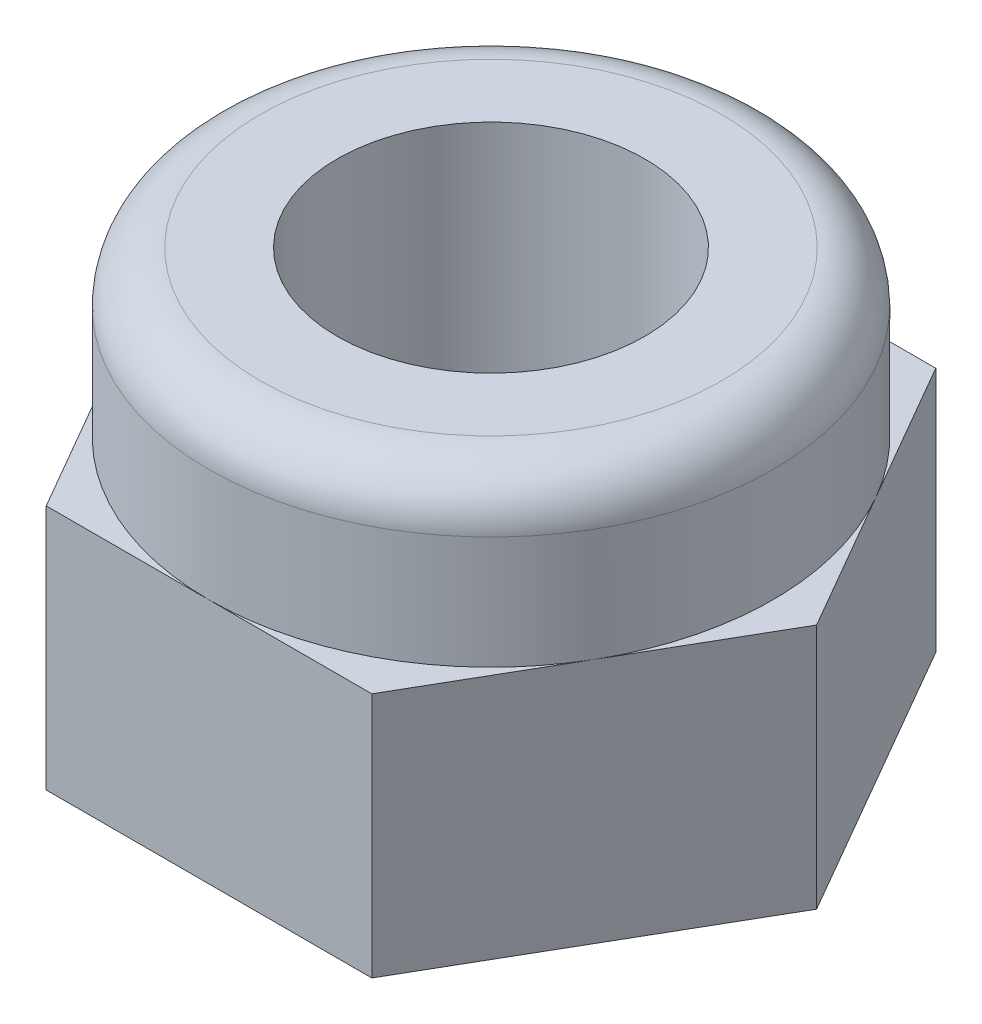
ISO-10303-21;
HEADER;
FILE_DESCRIPTION(('STEP AP214'),'2;1');
FILE_NAME('part.step','',(''),(''),'','','');
FILE_SCHEMA(('AUTOMOTIVE_DESIGN { 1 0 10303 214 1 1 1 1 }'));
ENDSEC;
DATA;
#1=APPLICATION_CONTEXT('core data for automotive mechanical design processes');
#2=APPLICATION_PROTOCOL_DEFINITION('international standard','automotive_design',2000,#1);
#3=PRODUCT_CONTEXT('',#1,'mechanical');
#4=PRODUCT('Part','Part','',(#3));
#5=PRODUCT_RELATED_PRODUCT_CATEGORY('part','',(#4));
#6=PRODUCT_DEFINITION_FORMATION('','',#4);
#7=PRODUCT_DEFINITION_CONTEXT('part definition',#1,'design');
#8=PRODUCT_DEFINITION('design','',#6,#7);
#9=PRODUCT_DEFINITION_SHAPE('','',#8);
#10=(LENGTH_UNIT() NAMED_UNIT(*) SI_UNIT(.MILLI.,.METRE.));
#11=(NAMED_UNIT(*) PLANE_ANGLE_UNIT() SI_UNIT($,.RADIAN.));
#12=(NAMED_UNIT(*) SI_UNIT($,.STERADIAN.) SOLID_ANGLE_UNIT());
#13=UNCERTAINTY_MEASURE_WITH_UNIT(LENGTH_MEASURE(1.E-05),#10,'distance_accuracy_value','');
#14=(GEOMETRIC_REPRESENTATION_CONTEXT(3) GLOBAL_UNCERTAINTY_ASSIGNED_CONTEXT((#13)) GLOBAL_UNIT_ASSIGNED_CONTEXT((#10,
#11,#12)) REPRESENTATION_CONTEXT('',''));
#15=CARTESIAN_POINT('',(0.,0.,0.));
#16=DIRECTION('',(0.,0.,1.));
#17=DIRECTION('',(1.,0.,0.));
#18=AXIS2_PLACEMENT_3D('',#15,#16,#17);
#19=CARTESIAN_POINT('',(0.,2.4,0.));
#20=DIRECTION('',(0.,1.,0.));
#21=DIRECTION('',(0.,0.,1.));
#22=AXIS2_PLACEMENT_3D('',#19,#20,#21);
#23=PLANE('',#22);
#24=CARTESIAN_POINT('',(0.,2.4,0.));
#25=DIRECTION('',(0.,1.,0.));
#26=DIRECTION('',(0.,0.,1.));
#27=AXIS2_PLACEMENT_3D('',#24,#25,#26);
#28=CIRCLE('',#27,2.75);
#29=CARTESIAN_POINT('',(0.,2.4,2.75));
#30=VERTEX_POINT('',#29);
#31=CARTESIAN_POINT('',(2.38156986040721,2.4,1.375));
#32=VERTEX_POINT('',#31);
#33=EDGE_CURVE('E126',#30,#32,#28,.T.);
#34=ORIENTED_EDGE('',*,*,#33,.F.);
#35=DIRECTION('',(1.,0.,0.));
#36=VECTOR('',#35,1.);
#37=CARTESIAN_POINT('',(-1.58771324027147,2.4,2.75));
#38=LINE('',#37,#36);
#39=CARTESIAN_POINT('',(1.58771324027147,2.4,2.75));
#40=VERTEX_POINT('',#39);
#41=EDGE_CURVE('E115',#30,#40,#38,.T.);
#42=ORIENTED_EDGE('',*,*,#41,.T.);
#43=DIRECTION('',(0.5,0.,-0.866025403784439));
#44=VECTOR('',#43,1.);
#45=CARTESIAN_POINT('',(1.58771324027147,2.4,2.75));
#46=LINE('',#45,#44);
#47=EDGE_CURVE('E127',#40,#32,#46,.T.);
#48=ORIENTED_EDGE('',*,*,#47,.T.);
#49=EDGE_LOOP('',(#34,#42,#48));
#50=FACE_BOUND('',#49,.T.);
#51=ADVANCED_FACE('F37',(#50),#23,.T.);
#52=CARTESIAN_POINT('',(2.38156986040721,2.4,-1.375));
#53=VERTEX_POINT('',#52);
#54=EDGE_CURVE('E133',#32,#53,#28,.T.);
#55=ORIENTED_EDGE('',*,*,#54,.F.);
#56=CARTESIAN_POINT('',(3.17542648054294,2.4,0.));
#57=VERTEX_POINT('',#56);
#58=EDGE_CURVE('E148',#32,#57,#46,.T.);
#59=ORIENTED_EDGE('',*,*,#58,.T.);
#60=DIRECTION('',(-0.5,0.,-0.866025403784438));
#61=VECTOR('',#60,1.);
#62=CARTESIAN_POINT('',(3.17542648054294,2.4,0.));
#63=LINE('',#62,#61);
#64=EDGE_CURVE('E149',#57,#53,#63,.T.);
#65=ORIENTED_EDGE('',*,*,#64,.T.);
#66=EDGE_LOOP('',(#55,#59,#65));
#67=FACE_BOUND('',#66,.T.);
#68=ADVANCED_FACE('F227',(#67),#23,.T.);
#69=CARTESIAN_POINT('',(0.,2.4,-2.75));
#70=VERTEX_POINT('',#69);
#71=EDGE_CURVE('E186',#53,#70,#28,.T.);
#72=ORIENTED_EDGE('',*,*,#71,.F.);
#73=CARTESIAN_POINT('',(1.58771324027147,2.4,-2.75));
#74=VERTEX_POINT('',#73);
#75=EDGE_CURVE('E147',#53,#74,#63,.T.);
#76=ORIENTED_EDGE('',*,*,#75,.T.);
#77=DIRECTION('',(-1.,0.,0.));
#78=VECTOR('',#77,1.);
#79=CARTESIAN_POINT('',(1.58771324027147,2.4,-2.75));
#80=LINE('',#79,#78);
#81=EDGE_CURVE('E153',#74,#70,#80,.T.);
#82=ORIENTED_EDGE('',*,*,#81,.T.);
#83=EDGE_LOOP('',(#72,#76,#82));
#84=FACE_BOUND('',#83,.T.);
#85=ADVANCED_FACE('F197',(#84),#23,.T.);
#86=CARTESIAN_POINT('',(-2.38156986040721,2.4,-1.375));
#87=VERTEX_POINT('',#86);
#88=EDGE_CURVE('E137',#70,#87,#28,.T.);
#89=ORIENTED_EDGE('',*,*,#88,.F.);
#90=CARTESIAN_POINT('',(-1.58771324027147,2.4,-2.75));
#91=VERTEX_POINT('',#90);
#92=EDGE_CURVE('E152',#70,#91,#80,.T.);
#93=ORIENTED_EDGE('',*,*,#92,.T.);
#94=DIRECTION('',(-0.5,0.,0.866025403784438));
#95=VECTOR('',#94,1.);
#96=CARTESIAN_POINT('',(-1.58771324027147,2.4,-2.75));
#97=LINE('',#96,#95);
#98=EDGE_CURVE('E157',#91,#87,#97,.T.);
#99=ORIENTED_EDGE('',*,*,#98,.T.);
#100=EDGE_LOOP('',(#89,#93,#99));
#101=FACE_BOUND('',#100,.T.);
#102=ADVANCED_FACE('F190',(#101),#23,.T.);
#103=CARTESIAN_POINT('',(-2.38156986040721,2.4,1.375));
#104=VERTEX_POINT('',#103);
#105=EDGE_CURVE('E60',#87,#104,#28,.T.);
#106=ORIENTED_EDGE('',*,*,#105,.F.);
#107=CARTESIAN_POINT('',(-3.17542648054294,2.4,0.));
#108=VERTEX_POINT('',#107);
#109=EDGE_CURVE('E156',#87,#108,#97,.T.);
#110=ORIENTED_EDGE('',*,*,#109,.T.);
#111=DIRECTION('',(0.5,0.,0.866025403784438));
#112=VECTOR('',#111,1.);
#113=CARTESIAN_POINT('',(-3.17542648054294,2.4,0.));
#114=LINE('',#113,#112);
#115=EDGE_CURVE('E124',#108,#104,#114,.T.);
#116=ORIENTED_EDGE('',*,*,#115,.T.);
#117=EDGE_LOOP('',(#106,#110,#116));
#118=FACE_BOUND('',#117,.T.);
#119=ADVANCED_FACE('F217',(#118),#23,.T.);
#120=EDGE_CURVE('E52',#104,#30,#28,.T.);
#121=ORIENTED_EDGE('',*,*,#120,.F.);
#122=CARTESIAN_POINT('',(-1.58771324027147,2.4,2.75));
#123=VERTEX_POINT('',#122);
#124=EDGE_CURVE('E110',#104,#123,#114,.T.);
#125=ORIENTED_EDGE('',*,*,#124,.T.);
#126=EDGE_CURVE('E107',#123,#30,#38,.T.);
#127=ORIENTED_EDGE('',*,*,#126,.T.);
#128=EDGE_LOOP('',(#121,#125,#127));
#129=FACE_BOUND('',#128,.T.);
#130=ADVANCED_FACE('F109',(#129),#23,.T.);
#131=CARTESIAN_POINT('',(0.,0.,0.));
#132=DIRECTION('',(0.,1.,0.));
#133=DIRECTION('',(0.,0.,1.));
#134=AXIS2_PLACEMENT_3D('',#131,#132,#133);
#135=PLANE('',#134);
#136=DIRECTION('',(0.5,0.,-0.866025403784439));
#137=VECTOR('',#136,1.);
#138=CARTESIAN_POINT('',(1.58771324027147,0.,2.75));
#139=LINE('',#138,#137);
#140=CARTESIAN_POINT('',(1.58771324027147,0.,2.75));
#141=VERTEX_POINT('',#140);
#142=CARTESIAN_POINT('',(3.17542648054294,0.,0.));
#143=VERTEX_POINT('',#142);
#144=EDGE_CURVE('E145',#141,#143,#139,.T.);
#145=ORIENTED_EDGE('',*,*,#144,.F.);
#146=DIRECTION('',(1.,0.,0.));
#147=VECTOR('',#146,1.);
#148=CARTESIAN_POINT('',(-1.58771324027147,0.,2.75));
#149=LINE('',#148,#147);
#150=CARTESIAN_POINT('',(-1.58771324027147,0.,2.75));
#151=VERTEX_POINT('',#150);
#152=EDGE_CURVE('E171',#151,#141,#149,.T.);
#153=ORIENTED_EDGE('',*,*,#152,.F.);
#154=DIRECTION('',(0.5,0.,0.866025403784438));
#155=VECTOR('',#154,1.);
#156=CARTESIAN_POINT('',(-3.17542648054294,0.,0.));
#157=LINE('',#156,#155);
#158=CARTESIAN_POINT('',(-3.17542648054294,0.,0.));
#159=VERTEX_POINT('',#158);
#160=EDGE_CURVE('E169',#159,#151,#157,.T.);
#161=ORIENTED_EDGE('',*,*,#160,.F.);
#162=DIRECTION('',(-0.5,0.,0.866025403784438));
#163=VECTOR('',#162,1.);
#164=CARTESIAN_POINT('',(-1.58771324027147,0.,-2.75));
#165=LINE('',#164,#163);
#166=CARTESIAN_POINT('',(-1.58771324027147,0.,-2.75));
#167=VERTEX_POINT('',#166);
#168=EDGE_CURVE('E167',#167,#159,#165,.T.);
#169=ORIENTED_EDGE('',*,*,#168,.F.);
#170=DIRECTION('',(-1.,0.,0.));
#171=VECTOR('',#170,1.);
#172=CARTESIAN_POINT('',(1.58771324027147,0.,-2.75));
#173=LINE('',#172,#171);
#174=CARTESIAN_POINT('',(1.58771324027147,0.,-2.75));
#175=VERTEX_POINT('',#174);
#176=EDGE_CURVE('E165',#175,#167,#173,.T.);
#177=ORIENTED_EDGE('',*,*,#176,.F.);
#178=DIRECTION('',(-0.5,0.,-0.866025403784438));
#179=VECTOR('',#178,1.);
#180=CARTESIAN_POINT('',(3.17542648054294,0.,0.));
#181=LINE('',#180,#179);
#182=EDGE_CURVE('E163',#143,#175,#181,.T.);
#183=ORIENTED_EDGE('',*,*,#182,.F.);
#184=EDGE_LOOP('',(#145,#153,#161,#169,#177,#183));
#185=FACE_BOUND('',#184,.T.);
#186=CARTESIAN_POINT('',(0.,0.,0.));
#187=DIRECTION('',(0.,1.,0.));
#188=DIRECTION('',(0.,0.,1.));
#189=AXIS2_PLACEMENT_3D('',#186,#187,#188);
#190=CIRCLE('',#189,1.5);
#191=CARTESIAN_POINT('',(0.,0.,1.5));
#192=VERTEX_POINT('',#191);
#193=EDGE_CURVE('E130',#192,#192,#190,.T.);
#194=ORIENTED_EDGE('',*,*,#193,.T.);
#195=EDGE_LOOP('',(#194));
#196=FACE_BOUND('',#195,.T.);
#197=ADVANCED_FACE('F207',(#185,#196),#135,.F.);
#198=CARTESIAN_POINT('',(1.58771324027147,2.4,2.75));
#199=DIRECTION('',(-0.866025403784439,0.,-0.5));
#200=DIRECTION('',(-0.5,0.,0.866025403784439));
#201=AXIS2_PLACEMENT_3D('',#198,#199,#200);
#202=PLANE('',#201);
#203=ORIENTED_EDGE('',*,*,#144,.T.);
#204=DIRECTION('',(0.,-1.,0.));
#205=VECTOR('',#204,1.);
#206=CARTESIAN_POINT('',(3.17542648054294,2.4,0.));
#207=LINE('',#206,#205);
#208=EDGE_CURVE('E136',#57,#143,#207,.T.);
#209=ORIENTED_EDGE('',*,*,#208,.F.);
#210=ORIENTED_EDGE('',*,*,#58,.F.);
#211=ORIENTED_EDGE('',*,*,#47,.F.);
#212=DIRECTION('',(0.,-1.,0.));
#213=VECTOR('',#212,1.);
#214=CARTESIAN_POINT('',(1.58771324027147,2.4,2.75));
#215=LINE('',#214,#213);
#216=EDGE_CURVE('E114',#40,#141,#215,.T.);
#217=ORIENTED_EDGE('',*,*,#216,.T.);
#218=EDGE_LOOP('',(#203,#209,#210,#211,#217));
#219=FACE_BOUND('',#218,.T.);
#220=ADVANCED_FACE('F238',(#219),#202,.F.);
#221=CARTESIAN_POINT('',(3.17542648054294,2.4,0.));
#222=DIRECTION('',(-0.866025403784439,0.,0.5));
#223=DIRECTION('',(0.5,0.,0.866025403784439));
#224=AXIS2_PLACEMENT_3D('',#221,#222,#223);
#225=PLANE('',#224);
#226=ORIENTED_EDGE('',*,*,#182,.T.);
#227=DIRECTION('',(0.,-1.,0.));
#228=VECTOR('',#227,1.);
#229=CARTESIAN_POINT('',(1.58771324027147,2.4,-2.75));
#230=LINE('',#229,#228);
#231=EDGE_CURVE('E139',#74,#175,#230,.T.);
#232=ORIENTED_EDGE('',*,*,#231,.F.);
#233=ORIENTED_EDGE('',*,*,#75,.F.);
#234=ORIENTED_EDGE('',*,*,#64,.F.);
#235=ORIENTED_EDGE('',*,*,#208,.T.);
#236=EDGE_LOOP('',(#226,#232,#233,#234,#235));
#237=FACE_BOUND('',#236,.T.);
#238=ADVANCED_FACE('F202',(#237),#225,.F.);
#239=CARTESIAN_POINT('',(1.58771324027147,2.4,-2.75));
#240=DIRECTION('',(0.,0.,1.));
#241=DIRECTION('',(1.,0.,0.));
#242=AXIS2_PLACEMENT_3D('',#239,#240,#241);
#243=PLANE('',#242);
#244=ORIENTED_EDGE('',*,*,#176,.T.);
#245=DIRECTION('',(0.,-1.,0.));
#246=VECTOR('',#245,1.);
#247=CARTESIAN_POINT('',(-1.58771324027147,2.4,-2.75));
#248=LINE('',#247,#246);
#249=EDGE_CURVE('E179',#91,#167,#248,.T.);
#250=ORIENTED_EDGE('',*,*,#249,.F.);
#251=ORIENTED_EDGE('',*,*,#92,.F.);
#252=ORIENTED_EDGE('',*,*,#81,.F.);
#253=ORIENTED_EDGE('',*,*,#231,.T.);
#254=EDGE_LOOP('',(#244,#250,#251,#252,#253));
#255=FACE_BOUND('',#254,.T.);
#256=ADVANCED_FACE('F195',(#255),#243,.F.);
#257=CARTESIAN_POINT('',(-1.58771324027147,2.4,-2.75));
#258=DIRECTION('',(0.866025403784439,0.,0.5));
#259=DIRECTION('',(0.5,0.,-0.866025403784439));
#260=AXIS2_PLACEMENT_3D('',#257,#258,#259);
#261=PLANE('',#260);
#262=ORIENTED_EDGE('',*,*,#168,.T.);
#263=DIRECTION('',(0.,-1.,0.));
#264=VECTOR('',#263,1.);
#265=CARTESIAN_POINT('',(-3.17542648054294,2.4,0.));
#266=LINE('',#265,#264);
#267=EDGE_CURVE('E176',#108,#159,#266,.T.);
#268=ORIENTED_EDGE('',*,*,#267,.F.);
#269=ORIENTED_EDGE('',*,*,#109,.F.);
#270=ORIENTED_EDGE('',*,*,#98,.F.);
#271=ORIENTED_EDGE('',*,*,#249,.T.);
#272=EDGE_LOOP('',(#262,#268,#269,#270,#271));
#273=FACE_BOUND('',#272,.T.);
#274=ADVANCED_FACE('F213',(#273),#261,.F.);
#275=CARTESIAN_POINT('',(-3.17542648054294,2.4,0.));
#276=DIRECTION('',(0.866025403784439,0.,-0.5));
#277=DIRECTION('',(-0.5,0.,-0.866025403784439));
#278=AXIS2_PLACEMENT_3D('',#275,#276,#277);
#279=PLANE('',#278);
#280=ORIENTED_EDGE('',*,*,#160,.T.);
#281=DIRECTION('',(0.,-1.,0.));
#282=VECTOR('',#281,1.);
#283=CARTESIAN_POINT('',(-1.58771324027147,2.4,2.75));
#284=LINE('',#283,#282);
#285=EDGE_CURVE('E174',#123,#151,#284,.T.);
#286=ORIENTED_EDGE('',*,*,#285,.F.);
#287=ORIENTED_EDGE('',*,*,#124,.F.);
#288=ORIENTED_EDGE('',*,*,#115,.F.);
#289=ORIENTED_EDGE('',*,*,#267,.T.);
#290=EDGE_LOOP('',(#280,#286,#287,#288,#289));
#291=FACE_BOUND('',#290,.T.);
#292=ADVANCED_FACE('F216',(#291),#279,.F.);
#293=CARTESIAN_POINT('',(-1.58771324027147,2.4,2.75));
#294=DIRECTION('',(0.,0.,-1.));
#295=DIRECTION('',(-1.,0.,0.));
#296=AXIS2_PLACEMENT_3D('',#293,#294,#295);
#297=PLANE('',#296);
#298=ORIENTED_EDGE('',*,*,#152,.T.);
#299=ORIENTED_EDGE('',*,*,#216,.F.);
#300=ORIENTED_EDGE('',*,*,#41,.F.);
#301=ORIENTED_EDGE('',*,*,#126,.F.);
#302=ORIENTED_EDGE('',*,*,#285,.T.);
#303=EDGE_LOOP('',(#298,#299,#300,#301,#302));
#304=FACE_BOUND('',#303,.T.);
#305=ADVANCED_FACE('F119',(#304),#297,.F.);
#306=CARTESIAN_POINT('',(0.,2.4,0.));
#307=DIRECTION('',(0.,-1.,0.));
#308=DIRECTION('',(0.,0.,-1.));
#309=AXIS2_PLACEMENT_3D('',#306,#307,#308);
#310=CYLINDRICAL_SURFACE('',#309,1.5);
#311=ORIENTED_EDGE('',*,*,#193,.F.);
#312=EDGE_LOOP('',(#311));
#313=FACE_BOUND('',#312,.T.);
#314=CARTESIAN_POINT('',(0.,4.,0.));
#315=DIRECTION('',(0.,1.,0.));
#316=DIRECTION('',(0.,0.,1.));
#317=AXIS2_PLACEMENT_3D('',#314,#315,#316);
#318=CIRCLE('',#317,1.5);
#319=CARTESIAN_POINT('',(0.,4.,1.5));
#320=VERTEX_POINT('',#319);
#321=EDGE_CURVE('E131',#320,#320,#318,.T.);
#322=ORIENTED_EDGE('',*,*,#321,.T.);
#323=EDGE_LOOP('',(#322));
#324=FACE_BOUND('',#323,.T.);
#325=ADVANCED_FACE('F253',(#313,#324),#310,.F.);
#326=CARTESIAN_POINT('',(0.,4.,0.));
#327=DIRECTION('',(0.,1.,0.));
#328=DIRECTION('',(0.,0.,1.));
#329=AXIS2_PLACEMENT_3D('',#326,#327,#328);
#330=PLANE('',#329);
#331=CARTESIAN_POINT('',(0.,4.,0.));
#332=DIRECTION('',(0.,1.,0.));
#333=DIRECTION('',(0.,0.,1.));
#334=AXIS2_PLACEMENT_3D('',#331,#332,#333);
#335=CIRCLE('',#334,2.25);
#336=CARTESIAN_POINT('',(0.,4.,2.25));
#337=VERTEX_POINT('',#336);
#338=EDGE_CURVE('E45',#337,#337,#335,.T.);
#339=ORIENTED_EDGE('',*,*,#338,.T.);
#340=EDGE_LOOP('',(#339));
#341=FACE_BOUND('',#340,.T.);
#342=ORIENTED_EDGE('',*,*,#321,.F.);
#343=EDGE_LOOP('',(#342));
#344=FACE_BOUND('',#343,.T.);
#345=ADVANCED_FACE('F257',(#341,#344),#330,.T.);
#346=CARTESIAN_POINT('',(0.,4.,0.));
#347=DIRECTION('',(0.,-1.,0.));
#348=DIRECTION('',(0.,0.,-1.));
#349=AXIS2_PLACEMENT_3D('',#346,#347,#348);
#350=CYLINDRICAL_SURFACE('',#349,2.75);
#351=CARTESIAN_POINT('',(0.,3.5,0.));
#352=DIRECTION('',(0.,1.,0.));
#353=DIRECTION('',(0.,0.,1.));
#354=AXIS2_PLACEMENT_3D('',#351,#352,#353);
#355=CIRCLE('',#354,2.75);
#356=CARTESIAN_POINT('',(0.,3.5,2.75));
#357=VERTEX_POINT('',#356);
#358=EDGE_CURVE('E11',#357,#357,#355,.F.);
#359=ORIENTED_EDGE('',*,*,#358,.T.);
#360=EDGE_LOOP('',(#359));
#361=FACE_BOUND('',#360,.T.);
#362=ORIENTED_EDGE('',*,*,#33,.T.);
#363=ORIENTED_EDGE('',*,*,#54,.T.);
#364=ORIENTED_EDGE('',*,*,#71,.T.);
#365=ORIENTED_EDGE('',*,*,#88,.T.);
#366=ORIENTED_EDGE('',*,*,#105,.T.);
#367=ORIENTED_EDGE('',*,*,#120,.T.);
#368=EDGE_LOOP('',(#362,#363,#364,#365,#366,#367));
#369=FACE_BOUND('',#368,.T.);
#370=ADVANCED_FACE('F134',(#361,#369),#350,.T.);
#371=CARTESIAN_POINT('',(0.,3.5,0.));
#372=DIRECTION('',(0.,1.,0.));
#373=DIRECTION('',(0.,0.,1.));
#374=AXIS2_PLACEMENT_3D('',#371,#372,#373);
#375=TOROIDAL_SURFACE('',#374,2.25,0.5);
#376=ORIENTED_EDGE('',*,*,#358,.F.);
#377=EDGE_LOOP('',(#376));
#378=FACE_BOUND('',#377,.T.);
#379=ORIENTED_EDGE('',*,*,#338,.F.);
#380=EDGE_LOOP('',(#379));
#381=FACE_BOUND('',#380,.T.);
#382=ADVANCED_FACE('F39',(#378,#381),#375,.T.);
#383=CLOSED_SHELL('',(#51,#68,#85,#102,#119,#130,#197,#220,#238,#256,#274,#292,#305,#325,#345,
#370,#382));
#384=MANIFOLD_SOLID_BREP('B2',#383);
#385=ADVANCED_BREP_SHAPE_REPRESENTATION('',(#18,#384),#14);
#386=SHAPE_DEFINITION_REPRESENTATION(#9,#385);
ENDSEC;
END-ISO-10303-21;
